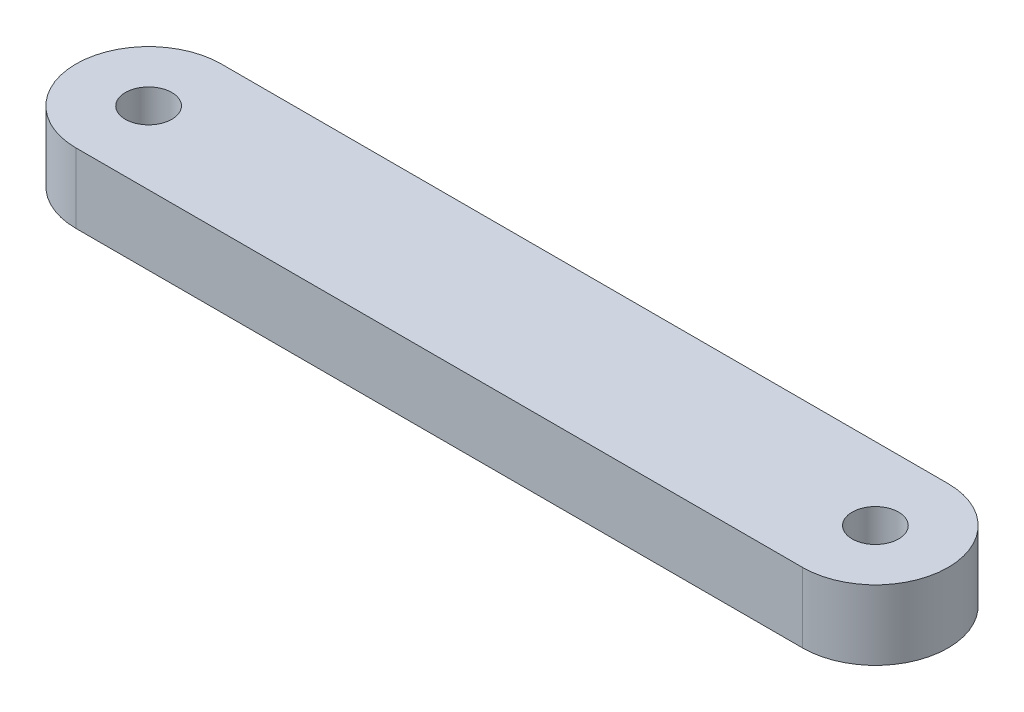
ISO-10303-21;
HEADER;
FILE_DESCRIPTION(('STEP AP214'),'2;1');
FILE_NAME('part.step','',(''),(''),'','','');
FILE_SCHEMA(('AUTOMOTIVE_DESIGN { 1 0 10303 214 1 1 1 1 }'));
ENDSEC;
DATA;
#1=APPLICATION_CONTEXT('core data for automotive mechanical design processes');
#2=APPLICATION_PROTOCOL_DEFINITION('international standard','automotive_design',2000,#1);
#3=PRODUCT_CONTEXT('',#1,'mechanical');
#4=PRODUCT('Part','Part','',(#3));
#5=PRODUCT_RELATED_PRODUCT_CATEGORY('part','',(#4));
#6=PRODUCT_DEFINITION_FORMATION('','',#4);
#7=PRODUCT_DEFINITION_CONTEXT('part definition',#1,'design');
#8=PRODUCT_DEFINITION('design','',#6,#7);
#9=PRODUCT_DEFINITION_SHAPE('','',#8);
#10=(LENGTH_UNIT() NAMED_UNIT(*) SI_UNIT(.MILLI.,.METRE.));
#11=(NAMED_UNIT(*) PLANE_ANGLE_UNIT() SI_UNIT($,.RADIAN.));
#12=(NAMED_UNIT(*) SI_UNIT($,.STERADIAN.) SOLID_ANGLE_UNIT());
#13=UNCERTAINTY_MEASURE_WITH_UNIT(LENGTH_MEASURE(1.E-05),#10,'distance_accuracy_value','');
#14=(GEOMETRIC_REPRESENTATION_CONTEXT(3) GLOBAL_UNCERTAINTY_ASSIGNED_CONTEXT((#13)) GLOBAL_UNIT_ASSIGNED_CONTEXT((#10,
#11,#12)) REPRESENTATION_CONTEXT('',''));
#15=CARTESIAN_POINT('',(0.,0.,0.));
#16=DIRECTION('',(0.,0.,1.));
#17=DIRECTION('',(1.,0.,0.));
#18=AXIS2_PLACEMENT_3D('',#15,#16,#17);
#19=CARTESIAN_POINT('',(-25.,4.8,0.));
#20=DIRECTION('',(0.,1.,0.));
#21=DIRECTION('',(0.,0.,1.));
#22=AXIS2_PLACEMENT_3D('',#19,#20,#21);
#23=PLANE('',#22);
#24=CARTESIAN_POINT('',(-25.,4.8,0.));
#25=DIRECTION('',(0.,1.,0.));
#26=DIRECTION('',(0.,0.,1.));
#27=AXIS2_PLACEMENT_3D('',#24,#25,#26);
#28=CIRCLE('',#27,1.6);
#29=CARTESIAN_POINT('',(-25.,4.8,1.6));
#30=VERTEX_POINT('',#29);
#31=EDGE_CURVE('E100',#30,#30,#28,.T.);
#32=ORIENTED_EDGE('',*,*,#31,.F.);
#33=EDGE_LOOP('',(#32));
#34=FACE_BOUND('',#33,.T.);
#35=CARTESIAN_POINT('',(-25.,4.8,0.));
#36=DIRECTION('',(0.,1.,0.));
#37=DIRECTION('',(0.,0.,1.));
#38=AXIS2_PLACEMENT_3D('',#35,#36,#37);
#39=CIRCLE('',#38,5.);
#40=CARTESIAN_POINT('',(-25.,4.8,-5.));
#41=VERTEX_POINT('',#40);
#42=CARTESIAN_POINT('',(-25.,4.8,5.));
#43=VERTEX_POINT('',#42);
#44=EDGE_CURVE('E85',#41,#43,#39,.T.);
#45=ORIENTED_EDGE('',*,*,#44,.T.);
#46=DIRECTION('',(1.,0.,0.));
#47=VECTOR('',#46,1.);
#48=CARTESIAN_POINT('',(-25.,4.8,5.));
#49=LINE('',#48,#47);
#50=CARTESIAN_POINT('',(25.,4.8,4.99999999999999));
#51=VERTEX_POINT('',#50);
#52=EDGE_CURVE('E80',#43,#51,#49,.T.);
#53=ORIENTED_EDGE('',*,*,#52,.T.);
#54=CARTESIAN_POINT('',(25.,4.8,0.));
#55=DIRECTION('',(0.,1.,0.));
#56=DIRECTION('',(0.,0.,1.));
#57=AXIS2_PLACEMENT_3D('',#54,#55,#56);
#58=CIRCLE('',#57,5.);
#59=CARTESIAN_POINT('',(25.,4.8,-5.00000000000001));
#60=VERTEX_POINT('',#59);
#61=EDGE_CURVE('E83',#51,#60,#58,.T.);
#62=ORIENTED_EDGE('',*,*,#61,.T.);
#63=DIRECTION('',(-1.,0.,0.));
#64=VECTOR('',#63,1.);
#65=CARTESIAN_POINT('',(-25.,4.8,-5.));
#66=LINE('',#65,#64);
#67=EDGE_CURVE('E50',#60,#41,#66,.T.);
#68=ORIENTED_EDGE('',*,*,#67,.T.);
#69=EDGE_LOOP('',(#45,#53,#62,#68));
#70=FACE_BOUND('',#69,.T.);
#71=CARTESIAN_POINT('',(25.,4.8,0.));
#72=DIRECTION('',(0.,1.,0.));
#73=DIRECTION('',(0.,0.,1.));
#74=AXIS2_PLACEMENT_3D('',#71,#72,#73);
#75=CIRCLE('',#74,1.6);
#76=CARTESIAN_POINT('',(25.,4.8,1.59999999999999));
#77=VERTEX_POINT('',#76);
#78=EDGE_CURVE('E115',#77,#77,#75,.T.);
#79=ORIENTED_EDGE('',*,*,#78,.F.);
#80=EDGE_LOOP('',(#79));
#81=FACE_BOUND('',#80,.T.);
#82=ADVANCED_FACE('F33',(#34,#70,#81),#23,.T.);
#83=CARTESIAN_POINT('',(-25.,0.,0.));
#84=DIRECTION('',(0.,1.,0.));
#85=DIRECTION('',(0.,0.,1.));
#86=AXIS2_PLACEMENT_3D('',#83,#84,#85);
#87=PLANE('',#86);
#88=CARTESIAN_POINT('',(-25.,0.,0.));
#89=DIRECTION('',(0.,1.,0.));
#90=DIRECTION('',(0.,0.,1.));
#91=AXIS2_PLACEMENT_3D('',#88,#89,#90);
#92=CIRCLE('',#91,5.);
#93=CARTESIAN_POINT('',(-25.,0.,-5.));
#94=VERTEX_POINT('',#93);
#95=CARTESIAN_POINT('',(-25.,0.,5.));
#96=VERTEX_POINT('',#95);
#97=EDGE_CURVE('E97',#94,#96,#92,.T.);
#98=ORIENTED_EDGE('',*,*,#97,.F.);
#99=DIRECTION('',(-1.,0.,0.));
#100=VECTOR('',#99,1.);
#101=CARTESIAN_POINT('',(-25.,0.,-5.));
#102=LINE('',#101,#100);
#103=CARTESIAN_POINT('',(25.,0.,-5.00000000000001));
#104=VERTEX_POINT('',#103);
#105=EDGE_CURVE('E73',#104,#94,#102,.T.);
#106=ORIENTED_EDGE('',*,*,#105,.F.);
#107=CARTESIAN_POINT('',(25.,0.,0.));
#108=DIRECTION('',(0.,1.,0.));
#109=DIRECTION('',(0.,0.,1.));
#110=AXIS2_PLACEMENT_3D('',#107,#108,#109);
#111=CIRCLE('',#110,5.);
#112=CARTESIAN_POINT('',(25.,0.,4.99999999999999));
#113=VERTEX_POINT('',#112);
#114=EDGE_CURVE('E67',#113,#104,#111,.T.);
#115=ORIENTED_EDGE('',*,*,#114,.F.);
#116=DIRECTION('',(1.,0.,0.));
#117=VECTOR('',#116,1.);
#118=CARTESIAN_POINT('',(-25.,0.,5.));
#119=LINE('',#118,#117);
#120=EDGE_CURVE('E89',#96,#113,#119,.T.);
#121=ORIENTED_EDGE('',*,*,#120,.F.);
#122=EDGE_LOOP('',(#98,#106,#115,#121));
#123=FACE_BOUND('',#122,.T.);
#124=CARTESIAN_POINT('',(-25.,0.,0.));
#125=DIRECTION('',(0.,1.,0.));
#126=DIRECTION('',(0.,0.,1.));
#127=AXIS2_PLACEMENT_3D('',#124,#125,#126);
#128=CIRCLE('',#127,1.6);
#129=CARTESIAN_POINT('',(-25.,0.,1.6));
#130=VERTEX_POINT('',#129);
#131=EDGE_CURVE('E112',#130,#130,#128,.T.);
#132=ORIENTED_EDGE('',*,*,#131,.T.);
#133=EDGE_LOOP('',(#132));
#134=FACE_BOUND('',#133,.T.);
#135=CARTESIAN_POINT('',(25.,0.,0.));
#136=DIRECTION('',(0.,1.,0.));
#137=DIRECTION('',(0.,0.,1.));
#138=AXIS2_PLACEMENT_3D('',#135,#136,#137);
#139=CIRCLE('',#138,1.6);
#140=CARTESIAN_POINT('',(25.,0.,1.59999999999999));
#141=VERTEX_POINT('',#140);
#142=EDGE_CURVE('E118',#141,#141,#139,.T.);
#143=ORIENTED_EDGE('',*,*,#142,.T.);
#144=EDGE_LOOP('',(#143));
#145=FACE_BOUND('',#144,.T.);
#146=ADVANCED_FACE('F108',(#123,#134,#145),#87,.F.);
#147=CARTESIAN_POINT('',(-25.,4.8,0.));
#148=DIRECTION('',(0.,-1.,0.));
#149=DIRECTION('',(0.,0.,-1.));
#150=AXIS2_PLACEMENT_3D('',#147,#148,#149);
#151=CYLINDRICAL_SURFACE('',#150,5.);
#152=ORIENTED_EDGE('',*,*,#97,.T.);
#153=DIRECTION('',(0.,-1.,0.));
#154=VECTOR('',#153,1.);
#155=CARTESIAN_POINT('',(-25.,4.8,5.));
#156=LINE('',#155,#154);
#157=EDGE_CURVE('E11',#43,#96,#156,.T.);
#158=ORIENTED_EDGE('',*,*,#157,.F.);
#159=ORIENTED_EDGE('',*,*,#44,.F.);
#160=DIRECTION('',(0.,-1.,0.));
#161=VECTOR('',#160,1.);
#162=CARTESIAN_POINT('',(-25.,4.8,-5.));
#163=LINE('',#162,#161);
#164=EDGE_CURVE('E93',#41,#94,#163,.T.);
#165=ORIENTED_EDGE('',*,*,#164,.T.);
#166=EDGE_LOOP('',(#152,#158,#159,#165));
#167=FACE_BOUND('',#166,.T.);
#168=ADVANCED_FACE('F35',(#167),#151,.T.);
#169=CARTESIAN_POINT('',(-25.,4.8,5.));
#170=DIRECTION('',(0.,0.,-1.));
#171=DIRECTION('',(-1.,0.,0.));
#172=AXIS2_PLACEMENT_3D('',#169,#170,#171);
#173=PLANE('',#172);
#174=ORIENTED_EDGE('',*,*,#120,.T.);
#175=DIRECTION('',(0.,-1.,0.));
#176=VECTOR('',#175,1.);
#177=CARTESIAN_POINT('',(25.,4.8,4.99999999999999));
#178=LINE('',#177,#176);
#179=EDGE_CURVE('E42',#51,#113,#178,.T.);
#180=ORIENTED_EDGE('',*,*,#179,.F.);
#181=ORIENTED_EDGE('',*,*,#52,.F.);
#182=ORIENTED_EDGE('',*,*,#157,.T.);
#183=EDGE_LOOP('',(#174,#180,#181,#182));
#184=FACE_BOUND('',#183,.T.);
#185=ADVANCED_FACE('F88',(#184),#173,.F.);
#186=CARTESIAN_POINT('',(25.,4.8,0.));
#187=DIRECTION('',(0.,-1.,0.));
#188=DIRECTION('',(0.,0.,-1.));
#189=AXIS2_PLACEMENT_3D('',#186,#187,#188);
#190=CYLINDRICAL_SURFACE('',#189,5.);
#191=ORIENTED_EDGE('',*,*,#114,.T.);
#192=DIRECTION('',(0.,-1.,0.));
#193=VECTOR('',#192,1.);
#194=CARTESIAN_POINT('',(25.,4.8,-5.00000000000001));
#195=LINE('',#194,#193);
#196=EDGE_CURVE('E90',#60,#104,#195,.T.);
#197=ORIENTED_EDGE('',*,*,#196,.F.);
#198=ORIENTED_EDGE('',*,*,#61,.F.);
#199=ORIENTED_EDGE('',*,*,#179,.T.);
#200=EDGE_LOOP('',(#191,#197,#198,#199));
#201=FACE_BOUND('',#200,.T.);
#202=ADVANCED_FACE('F91',(#201),#190,.T.);
#203=CARTESIAN_POINT('',(-25.,4.8,-5.));
#204=DIRECTION('',(0.,0.,1.));
#205=DIRECTION('',(1.,0.,0.));
#206=AXIS2_PLACEMENT_3D('',#203,#204,#205);
#207=PLANE('',#206);
#208=ORIENTED_EDGE('',*,*,#105,.T.);
#209=ORIENTED_EDGE('',*,*,#164,.F.);
#210=ORIENTED_EDGE('',*,*,#67,.F.);
#211=ORIENTED_EDGE('',*,*,#196,.T.);
#212=EDGE_LOOP('',(#208,#209,#210,#211));
#213=FACE_BOUND('',#212,.T.);
#214=ADVANCED_FACE('F105',(#213),#207,.F.);
#215=CARTESIAN_POINT('',(-25.,4.8,0.));
#216=DIRECTION('',(0.,-1.,0.));
#217=DIRECTION('',(0.,0.,-1.));
#218=AXIS2_PLACEMENT_3D('',#215,#216,#217);
#219=CYLINDRICAL_SURFACE('',#218,1.6);
#220=ORIENTED_EDGE('',*,*,#31,.T.);
#221=EDGE_LOOP('',(#220));
#222=FACE_BOUND('',#221,.T.);
#223=ORIENTED_EDGE('',*,*,#131,.F.);
#224=EDGE_LOOP('',(#223));
#225=FACE_BOUND('',#224,.T.);
#226=ADVANCED_FACE('F135',(#222,#225),#219,.F.);
#227=CARTESIAN_POINT('',(25.,4.8,0.));
#228=DIRECTION('',(0.,-1.,0.));
#229=DIRECTION('',(0.,0.,-1.));
#230=AXIS2_PLACEMENT_3D('',#227,#228,#229);
#231=CYLINDRICAL_SURFACE('',#230,1.6);
#232=ORIENTED_EDGE('',*,*,#78,.T.);
#233=EDGE_LOOP('',(#232));
#234=FACE_BOUND('',#233,.T.);
#235=ORIENTED_EDGE('',*,*,#142,.F.);
#236=EDGE_LOOP('',(#235));
#237=FACE_BOUND('',#236,.T.);
#238=ADVANCED_FACE('F124',(#234,#237),#231,.F.);
#239=CLOSED_SHELL('',(#82,#146,#168,#185,#202,#214,#226,#238));
#240=MANIFOLD_SOLID_BREP('B2',#239);
#241=ADVANCED_BREP_SHAPE_REPRESENTATION('',(#18,#240),#14);
#242=SHAPE_DEFINITION_REPRESENTATION(#9,#241);
ENDSEC;
END-ISO-10303-21;
